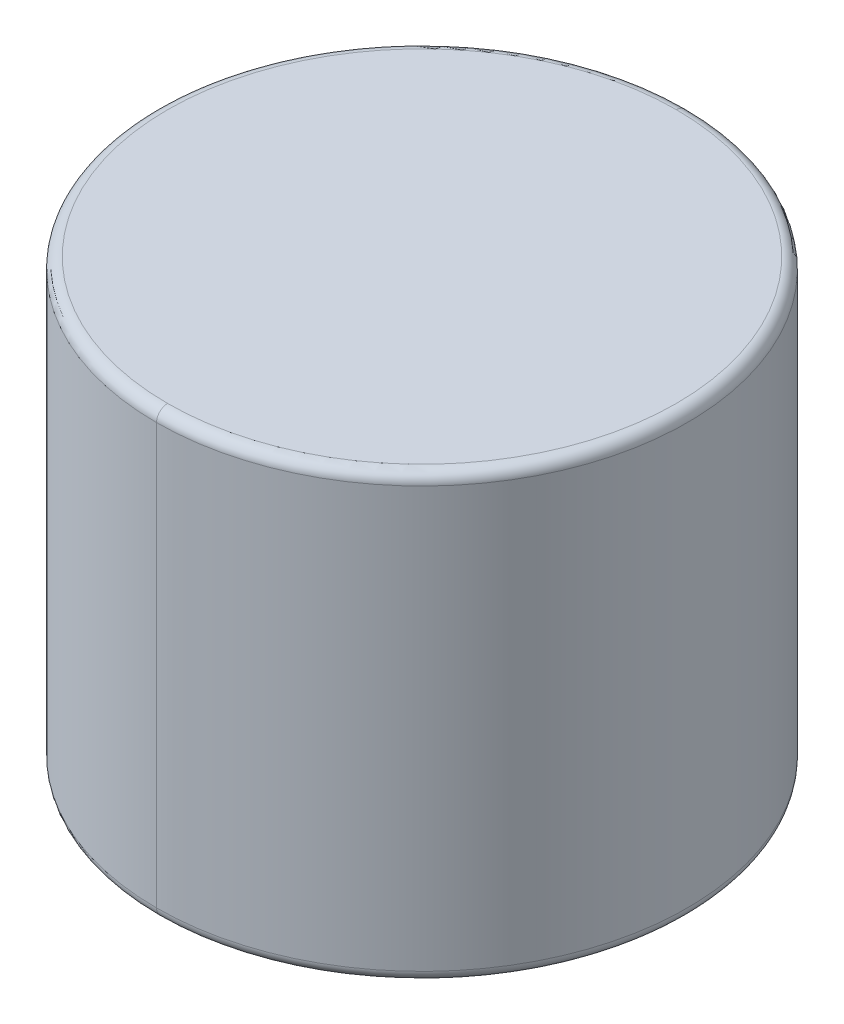
ISO-10303-21;
HEADER;
FILE_DESCRIPTION(('STEP AP214'),'2;1');
FILE_NAME('part.step','',(''),(''),'','','');
FILE_SCHEMA(('AUTOMOTIVE_DESIGN { 1 0 10303 214 1 1 1 1 }'));
ENDSEC;
DATA;
#1=APPLICATION_CONTEXT('core data for automotive mechanical design processes');
#2=APPLICATION_PROTOCOL_DEFINITION('international standard','automotive_design',2000,#1);
#3=PRODUCT_CONTEXT('',#1,'mechanical');
#4=PRODUCT('Part','Part','',(#3));
#5=PRODUCT_RELATED_PRODUCT_CATEGORY('part','',(#4));
#6=PRODUCT_DEFINITION_FORMATION('','',#4);
#7=PRODUCT_DEFINITION_CONTEXT('part definition',#1,'design');
#8=PRODUCT_DEFINITION('design','',#6,#7);
#9=PRODUCT_DEFINITION_SHAPE('','',#8);
#10=(LENGTH_UNIT() NAMED_UNIT(*) SI_UNIT(.MILLI.,.METRE.));
#11=(NAMED_UNIT(*) PLANE_ANGLE_UNIT() SI_UNIT($,.RADIAN.));
#12=(NAMED_UNIT(*) SI_UNIT($,.STERADIAN.) SOLID_ANGLE_UNIT());
#13=UNCERTAINTY_MEASURE_WITH_UNIT(LENGTH_MEASURE(1.E-05),#10,'distance_accuracy_value','');
#14=(GEOMETRIC_REPRESENTATION_CONTEXT(3) GLOBAL_UNCERTAINTY_ASSIGNED_CONTEXT((#13)) GLOBAL_UNIT_ASSIGNED_CONTEXT((#10,
#11,#12)) REPRESENTATION_CONTEXT('',''));
#15=CARTESIAN_POINT('',(0.,0.,0.));
#16=DIRECTION('',(0.,0.,1.));
#17=DIRECTION('',(1.,0.,0.));
#18=AXIS2_PLACEMENT_3D('',#15,#16,#17);
#19=CARTESIAN_POINT('',(0.,4.875,0.));
#20=DIRECTION('',(0.,1.,0.));
#21=DIRECTION('',(0.,0.,1.));
#22=AXIS2_PLACEMENT_3D('',#19,#20,#21);
#23=TOROIDAL_SURFACE('',#22,2.875,0.125);
#24=CARTESIAN_POINT('',(0.,4.875,0.));
#25=DIRECTION('',(0.,-1.,0.));
#26=DIRECTION('',(0.,0.,1.));
#27=AXIS2_PLACEMENT_3D('',#24,#25,#26);
#28=CIRCLE('',#27,3.);
#29=CARTESIAN_POINT('',(0.,4.875,-3.));
#30=VERTEX_POINT('',#29);
#31=CARTESIAN_POINT('',(0.,4.875,3.));
#32=VERTEX_POINT('',#31);
#33=EDGE_CURVE('E106',#30,#32,#28,.T.);
#34=ORIENTED_EDGE('',*,*,#33,.F.);
#35=CARTESIAN_POINT('',(0.,4.875,-2.875));
#36=DIRECTION('',(1.,0.,0.));
#37=DIRECTION('',(0.,0.,-1.));
#38=AXIS2_PLACEMENT_3D('',#35,#36,#37);
#39=CIRCLE('',#38,0.125);
#40=CARTESIAN_POINT('',(0.,5.,-2.875));
#41=VERTEX_POINT('',#40);
#42=EDGE_CURVE('E10',#30,#41,#39,.T.);
#43=ORIENTED_EDGE('',*,*,#42,.T.);
#44=CARTESIAN_POINT('',(0.,5.,0.));
#45=DIRECTION('',(0.,1.,0.));
#46=DIRECTION('',(0.,0.,1.));
#47=AXIS2_PLACEMENT_3D('',#44,#45,#46);
#48=CIRCLE('',#47,2.875);
#49=CARTESIAN_POINT('',(0.,5.,2.875));
#50=VERTEX_POINT('',#49);
#51=EDGE_CURVE('E97',#50,#41,#48,.T.);
#52=ORIENTED_EDGE('',*,*,#51,.F.);
#53=CARTESIAN_POINT('',(0.,4.875,2.875));
#54=DIRECTION('',(-1.,0.,0.));
#55=DIRECTION('',(0.,0.,1.));
#56=AXIS2_PLACEMENT_3D('',#53,#54,#55);
#57=CIRCLE('',#56,0.125);
#58=EDGE_CURVE('E80',#32,#50,#57,.T.);
#59=ORIENTED_EDGE('',*,*,#58,.F.);
#60=EDGE_LOOP('',(#34,#43,#52,#59));
#61=FACE_BOUND('',#60,.T.);
#62=ADVANCED_FACE('F15',(#61),#23,.T.);
#63=CARTESIAN_POINT('',(0.,0.125,0.));
#64=DIRECTION('',(0.,1.,0.));
#65=DIRECTION('',(0.,0.,1.));
#66=AXIS2_PLACEMENT_3D('',#63,#64,#65);
#67=TOROIDAL_SURFACE('',#66,2.875,0.125);
#68=CARTESIAN_POINT('',(0.,0.,0.));
#69=DIRECTION('',(0.,-1.,0.));
#70=DIRECTION('',(0.,0.,1.));
#71=AXIS2_PLACEMENT_3D('',#68,#69,#70);
#72=CIRCLE('',#71,2.875);
#73=CARTESIAN_POINT('',(0.,0.,-2.875));
#74=VERTEX_POINT('',#73);
#75=CARTESIAN_POINT('',(0.,0.,2.875));
#76=VERTEX_POINT('',#75);
#77=EDGE_CURVE('E72',#74,#76,#72,.T.);
#78=ORIENTED_EDGE('',*,*,#77,.F.);
#79=CARTESIAN_POINT('',(0.,0.125,-2.875));
#80=DIRECTION('',(1.,0.,0.));
#81=DIRECTION('',(0.,0.,-1.));
#82=AXIS2_PLACEMENT_3D('',#79,#80,#81);
#83=CIRCLE('',#82,0.125);
#84=CARTESIAN_POINT('',(0.,0.125,-3.));
#85=VERTEX_POINT('',#84);
#86=EDGE_CURVE('E26',#74,#85,#83,.T.);
#87=ORIENTED_EDGE('',*,*,#86,.T.);
#88=CARTESIAN_POINT('',(0.,0.125,0.));
#89=DIRECTION('',(0.,1.,0.));
#90=DIRECTION('',(0.,0.,1.));
#91=AXIS2_PLACEMENT_3D('',#88,#89,#90);
#92=CIRCLE('',#91,3.);
#93=CARTESIAN_POINT('',(0.,0.125,3.));
#94=VERTEX_POINT('',#93);
#95=EDGE_CURVE('E74',#94,#85,#92,.T.);
#96=ORIENTED_EDGE('',*,*,#95,.F.);
#97=CARTESIAN_POINT('',(0.,0.125,2.875));
#98=DIRECTION('',(-1.,0.,0.));
#99=DIRECTION('',(0.,0.,1.));
#100=AXIS2_PLACEMENT_3D('',#97,#98,#99);
#101=CIRCLE('',#100,0.125);
#102=EDGE_CURVE('E68',#76,#94,#101,.T.);
#103=ORIENTED_EDGE('',*,*,#102,.F.);
#104=EDGE_LOOP('',(#78,#87,#96,#103));
#105=FACE_BOUND('',#104,.T.);
#106=ADVANCED_FACE('F70',(#105),#67,.T.);
#107=CARTESIAN_POINT('',(0.,5.,0.));
#108=DIRECTION('',(0.,-1.,0.));
#109=DIRECTION('',(0.,0.,-1.));
#110=AXIS2_PLACEMENT_3D('',#107,#108,#109);
#111=CYLINDRICAL_SURFACE('',#110,3.);
#112=ORIENTED_EDGE('',*,*,#33,.T.);
#113=DIRECTION('',(0.,-1.,0.));
#114=VECTOR('',#113,1.);
#115=CARTESIAN_POINT('',(0.,5.,3.));
#116=LINE('',#115,#114);
#117=EDGE_CURVE('E104',#32,#94,#116,.T.);
#118=ORIENTED_EDGE('',*,*,#117,.T.);
#119=ORIENTED_EDGE('',*,*,#95,.T.);
#120=DIRECTION('',(0.,-1.,0.));
#121=VECTOR('',#120,1.);
#122=CARTESIAN_POINT('',(0.,5.,-3.));
#123=LINE('',#122,#121);
#124=EDGE_CURVE('E41',#30,#85,#123,.T.);
#125=ORIENTED_EDGE('',*,*,#124,.F.);
#126=EDGE_LOOP('',(#112,#118,#119,#125));
#127=FACE_BOUND('',#126,.T.);
#128=ADVANCED_FACE('F17',(#127),#111,.T.);
#129=CARTESIAN_POINT('',(0.,5.,0.));
#130=DIRECTION('',(0.,-1.,0.));
#131=DIRECTION('',(0.,0.,-1.));
#132=AXIS2_PLACEMENT_3D('',#129,#130,#131);
#133=CYLINDRICAL_SURFACE('',#132,3.);
#134=ORIENTED_EDGE('',*,*,#117,.F.);
#135=CARTESIAN_POINT('',(0.,4.875,0.));
#136=DIRECTION('',(0.,-1.,0.));
#137=DIRECTION('',(0.,0.,1.));
#138=AXIS2_PLACEMENT_3D('',#135,#136,#137);
#139=CIRCLE('',#138,3.);
#140=EDGE_CURVE('E101',#32,#30,#139,.T.);
#141=ORIENTED_EDGE('',*,*,#140,.T.);
#142=ORIENTED_EDGE('',*,*,#124,.T.);
#143=CARTESIAN_POINT('',(0.,0.125,0.));
#144=DIRECTION('',(0.,1.,0.));
#145=DIRECTION('',(0.,0.,1.));
#146=AXIS2_PLACEMENT_3D('',#143,#144,#145);
#147=CIRCLE('',#146,3.);
#148=EDGE_CURVE('E119',#85,#94,#147,.T.);
#149=ORIENTED_EDGE('',*,*,#148,.T.);
#150=EDGE_LOOP('',(#134,#141,#142,#149));
#151=FACE_BOUND('',#150,.T.);
#152=ADVANCED_FACE('F202',(#151),#133,.T.);
#153=CARTESIAN_POINT('',(0.,5.,0.));
#154=DIRECTION('',(0.,1.,0.));
#155=DIRECTION('',(1.,0.,0.));
#156=AXIS2_PLACEMENT_3D('',#153,#154,#155);
#157=PLANE('',#156);
#158=ORIENTED_EDGE('',*,*,#51,.T.);
#159=CARTESIAN_POINT('',(0.,5.,0.));
#160=DIRECTION('',(0.,1.,0.));
#161=DIRECTION('',(0.,0.,1.));
#162=AXIS2_PLACEMENT_3D('',#159,#160,#161);
#163=CIRCLE('',#162,2.875);
#164=EDGE_CURVE('E19',#41,#50,#163,.T.);
#165=ORIENTED_EDGE('',*,*,#164,.T.);
#166=EDGE_LOOP('',(#158,#165));
#167=FACE_BOUND('',#166,.T.);
#168=ADVANCED_FACE('F132',(#167),#157,.T.);
#169=CARTESIAN_POINT('',(0.,0.,0.));
#170=DIRECTION('',(0.,1.,0.));
#171=DIRECTION('',(1.,0.,0.));
#172=AXIS2_PLACEMENT_3D('',#169,#170,#171);
#173=PLANE('',#172);
#174=CARTESIAN_POINT('',(0.,0.,0.));
#175=DIRECTION('',(0.,-1.,0.));
#176=DIRECTION('',(0.,0.,1.));
#177=AXIS2_PLACEMENT_3D('',#174,#175,#176);
#178=CIRCLE('',#177,2.875);
#179=EDGE_CURVE('E85',#76,#74,#178,.T.);
#180=ORIENTED_EDGE('',*,*,#179,.T.);
#181=ORIENTED_EDGE('',*,*,#77,.T.);
#182=EDGE_LOOP('',(#180,#181));
#183=FACE_BOUND('',#182,.T.);
#184=ADVANCED_FACE('F84',(#183),#173,.F.);
#185=CARTESIAN_POINT('',(0.,0.125,0.));
#186=DIRECTION('',(0.,1.,0.));
#187=DIRECTION('',(0.,0.,1.));
#188=AXIS2_PLACEMENT_3D('',#185,#186,#187);
#189=TOROIDAL_SURFACE('',#188,2.875,0.125);
#190=ORIENTED_EDGE('',*,*,#86,.F.);
#191=ORIENTED_EDGE('',*,*,#179,.F.);
#192=ORIENTED_EDGE('',*,*,#102,.T.);
#193=ORIENTED_EDGE('',*,*,#148,.F.);
#194=EDGE_LOOP('',(#190,#191,#192,#193));
#195=FACE_BOUND('',#194,.T.);
#196=ADVANCED_FACE('F88',(#195),#189,.T.);
#197=CARTESIAN_POINT('',(0.,4.875,0.));
#198=DIRECTION('',(0.,1.,0.));
#199=DIRECTION('',(0.,0.,1.));
#200=AXIS2_PLACEMENT_3D('',#197,#198,#199);
#201=TOROIDAL_SURFACE('',#200,2.875,0.125);
#202=ORIENTED_EDGE('',*,*,#42,.F.);
#203=ORIENTED_EDGE('',*,*,#140,.F.);
#204=ORIENTED_EDGE('',*,*,#58,.T.);
#205=ORIENTED_EDGE('',*,*,#164,.F.);
#206=EDGE_LOOP('',(#202,#203,#204,#205));
#207=FACE_BOUND('',#206,.T.);
#208=ADVANCED_FACE('F137',(#207),#201,.T.);
#209=CLOSED_SHELL('',(#62,#106,#128,#152,#168,#184,#196,#208));
#210=MANIFOLD_SOLID_BREP('B1',#209);
#211=ADVANCED_BREP_SHAPE_REPRESENTATION('',(#18,#210),#14);
#212=SHAPE_DEFINITION_REPRESENTATION(#9,#211);
ENDSEC;
END-ISO-10303-21;
